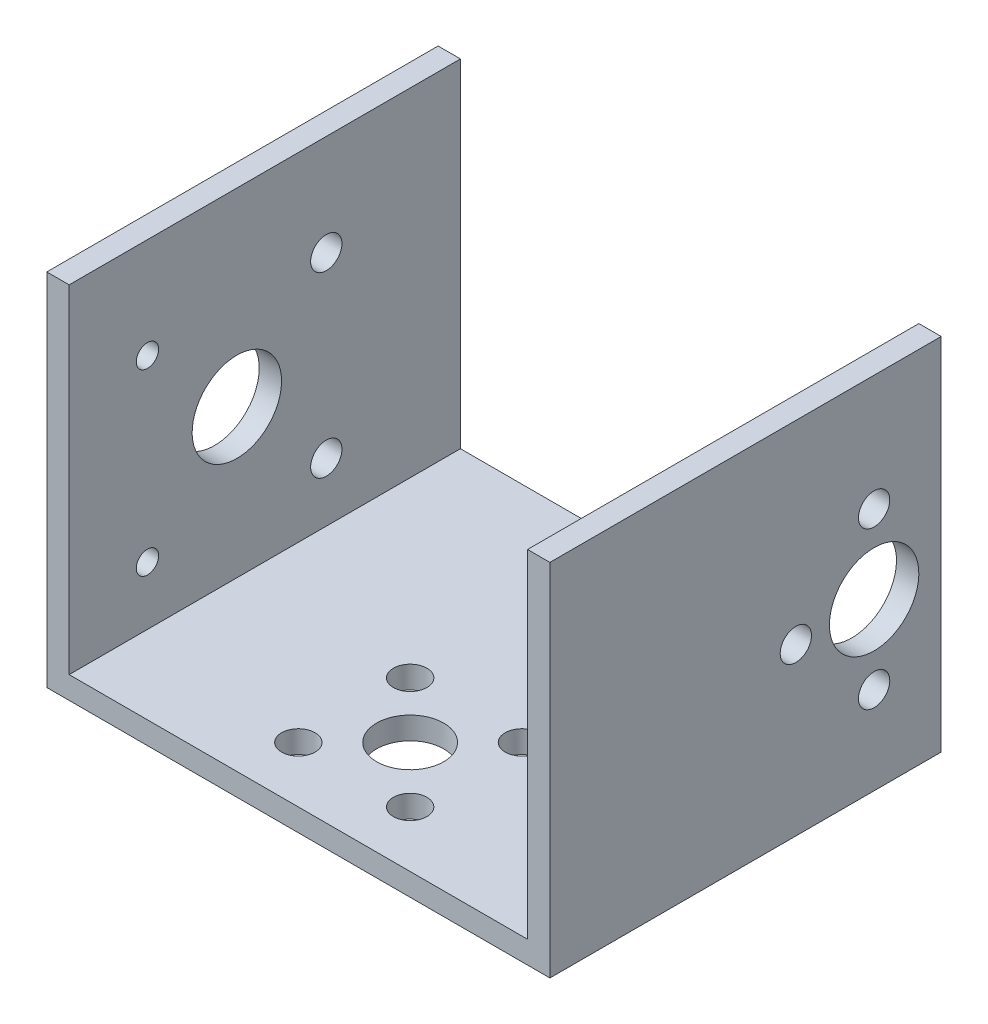
ISO-10303-21;
HEADER;
FILE_DESCRIPTION(('STEP AP214'),'2;1');
FILE_NAME('part.step','',(''),(''),'','','');
FILE_SCHEMA(('AUTOMOTIVE_DESIGN { 1 0 10303 214 1 1 1 1 }'));
ENDSEC;
DATA;
#1=APPLICATION_CONTEXT('core data for automotive mechanical design processes');
#2=APPLICATION_PROTOCOL_DEFINITION('international standard','automotive_design',2000,#1);
#3=PRODUCT_CONTEXT('',#1,'mechanical');
#4=PRODUCT('Part','Part','',(#3));
#5=PRODUCT_RELATED_PRODUCT_CATEGORY('part','',(#4));
#6=PRODUCT_DEFINITION_FORMATION('','',#4);
#7=PRODUCT_DEFINITION_CONTEXT('part definition',#1,'design');
#8=PRODUCT_DEFINITION('design','',#6,#7);
#9=PRODUCT_DEFINITION_SHAPE('','',#8);
#10=(LENGTH_UNIT() NAMED_UNIT(*) SI_UNIT(.MILLI.,.METRE.));
#11=(NAMED_UNIT(*) PLANE_ANGLE_UNIT() SI_UNIT($,.RADIAN.));
#12=(NAMED_UNIT(*) SI_UNIT($,.STERADIAN.) SOLID_ANGLE_UNIT());
#13=UNCERTAINTY_MEASURE_WITH_UNIT(LENGTH_MEASURE(1.E-05),#10,'distance_accuracy_value','');
#14=(GEOMETRIC_REPRESENTATION_CONTEXT(3) GLOBAL_UNCERTAINTY_ASSIGNED_CONTEXT((#13)) GLOBAL_UNIT_ASSIGNED_CONTEXT((#10,
#11,#12)) REPRESENTATION_CONTEXT('',''));
#15=CARTESIAN_POINT('',(0.,0.,0.));
#16=DIRECTION('',(0.,0.,1.));
#17=DIRECTION('',(1.,0.,0.));
#18=AXIS2_PLACEMENT_3D('',#15,#16,#17);
#19=CARTESIAN_POINT('',(20.5,0.902439024390143,20.));
#20=DIRECTION('',(0.,-1.,0.));
#21=DIRECTION('',(0.,0.,-1.));
#22=AXIS2_PLACEMENT_3D('',#19,#20,#21);
#23=PLANE('',#22);
#24=CARTESIAN_POINT('',(5.,0.902439024390144,20.));
#25=DIRECTION('',(0.,-1.,0.));
#26=DIRECTION('',(0.,0.,-1.));
#27=AXIS2_PLACEMENT_3D('',#24,#25,#26);
#28=CIRCLE('',#27,1.5);
#29=CARTESIAN_POINT('',(5.,0.902439024390144,18.5));
#30=VERTEX_POINT('',#29);
#31=EDGE_CURVE('E298',#30,#30,#28,.F.);
#32=ORIENTED_EDGE('',*,*,#31,.F.);
#33=EDGE_LOOP('',(#32));
#34=FACE_BOUND('',#33,.T.);
#35=CARTESIAN_POINT('',(5.,0.902439024390144,10.));
#36=DIRECTION('',(0.,-1.,0.));
#37=DIRECTION('',(0.,0.,-1.));
#38=AXIS2_PLACEMENT_3D('',#35,#36,#37);
#39=CIRCLE('',#38,1.5);
#40=CARTESIAN_POINT('',(5.,0.902439024390144,8.5));
#41=VERTEX_POINT('',#40);
#42=EDGE_CURVE('E297',#41,#41,#39,.F.);
#43=ORIENTED_EDGE('',*,*,#42,.F.);
#44=EDGE_LOOP('',(#43));
#45=FACE_BOUND('',#44,.T.);
#46=CARTESIAN_POINT('',(-5.,0.902439024390144,10.));
#47=DIRECTION('',(0.,-1.,0.));
#48=DIRECTION('',(0.,0.,-1.));
#49=AXIS2_PLACEMENT_3D('',#46,#47,#48);
#50=CIRCLE('',#49,1.5);
#51=CARTESIAN_POINT('',(-5.,0.902439024390144,8.5));
#52=VERTEX_POINT('',#51);
#53=EDGE_CURVE('E306',#52,#52,#50,.F.);
#54=ORIENTED_EDGE('',*,*,#53,.F.);
#55=EDGE_LOOP('',(#54));
#56=FACE_BOUND('',#55,.T.);
#57=CARTESIAN_POINT('',(0.,0.902439024390144,15.));
#58=DIRECTION('',(0.,-1.,0.));
#59=DIRECTION('',(0.,0.,-1.));
#60=AXIS2_PLACEMENT_3D('',#57,#58,#59);
#61=CIRCLE('',#60,3.);
#62=CARTESIAN_POINT('',(0.,0.902439024390144,12.));
#63=VERTEX_POINT('',#62);
#64=EDGE_CURVE('E314',#63,#63,#61,.F.);
#65=ORIENTED_EDGE('',*,*,#64,.F.);
#66=EDGE_LOOP('',(#65));
#67=FACE_BOUND('',#66,.T.);
#68=CARTESIAN_POINT('',(-5.,0.902439024390144,20.));
#69=DIRECTION('',(0.,-1.,0.));
#70=DIRECTION('',(0.,0.,-1.));
#71=AXIS2_PLACEMENT_3D('',#68,#69,#70);
#72=CIRCLE('',#71,1.5);
#73=CARTESIAN_POINT('',(-5.,0.902439024390144,18.5));
#74=VERTEX_POINT('',#73);
#75=EDGE_CURVE('E126',#74,#74,#72,.F.);
#76=ORIENTED_EDGE('',*,*,#75,.F.);
#77=EDGE_LOOP('',(#76));
#78=FACE_BOUND('',#77,.T.);
#79=DIRECTION('',(0.,0.,-1.));
#80=VECTOR('',#79,1.);
#81=CARTESIAN_POINT('',(-20.5,0.902439024390143,20.));
#82=LINE('',#81,#80);
#83=CARTESIAN_POINT('',(-20.5,0.902439024390143,25.));
#84=VERTEX_POINT('',#83);
#85=CARTESIAN_POINT('',(-20.5,0.902439024390144,-10.));
#86=VERTEX_POINT('',#85);
#87=EDGE_CURVE('E68',#84,#86,#82,.T.);
#88=ORIENTED_EDGE('',*,*,#87,.F.);
#89=DIRECTION('',(-1.,0.,0.));
#90=VECTOR('',#89,1.);
#91=CARTESIAN_POINT('',(-22.5,0.902439024390143,25.));
#92=LINE('',#91,#90);
#93=CARTESIAN_POINT('',(20.5,0.902439024390159,25.));
#94=VERTEX_POINT('',#93);
#95=EDGE_CURVE('E113',#94,#84,#92,.T.);
#96=ORIENTED_EDGE('',*,*,#95,.F.);
#97=DIRECTION('',(0.,0.,-1.));
#98=VECTOR('',#97,1.);
#99=CARTESIAN_POINT('',(20.5,0.902439024390143,20.));
#100=LINE('',#99,#98);
#101=CARTESIAN_POINT('',(20.5,0.902439024390158,-10.));
#102=VERTEX_POINT('',#101);
#103=EDGE_CURVE('E60',#94,#102,#100,.T.);
#104=ORIENTED_EDGE('',*,*,#103,.T.);
#105=DIRECTION('',(1.,0.,0.));
#106=VECTOR('',#105,1.);
#107=CARTESIAN_POINT('',(-22.5,0.902439024390143,-10.));
#108=LINE('',#107,#106);
#109=EDGE_CURVE('E114',#86,#102,#108,.T.);
#110=ORIENTED_EDGE('',*,*,#109,.F.);
#111=EDGE_LOOP('',(#88,#96,#104,#110));
#112=FACE_BOUND('',#111,.T.);
#113=ADVANCED_FACE('F43',(#34,#45,#56,#67,#78,#112),#23,.F.);
#114=CARTESIAN_POINT('',(20.5,0.902439024390143,20.));
#115=DIRECTION('',(1.,0.,0.));
#116=DIRECTION('',(0.,0.,-1.));
#117=AXIS2_PLACEMENT_3D('',#114,#115,#116);
#118=PLANE('',#117);
#119=CARTESIAN_POINT('',(20.5,13.7414610293343,3.));
#120=DIRECTION('',(1.,0.,0.));
#121=DIRECTION('',(0.,1.,0.));
#122=AXIS2_PLACEMENT_3D('',#119,#120,#121);
#123=CIRCLE('',#122,1.4);
#124=CARTESIAN_POINT('',(20.5,15.1414610293343,3.));
#125=VERTEX_POINT('',#124);
#126=EDGE_CURVE('E150',#125,#125,#123,.T.);
#127=ORIENTED_EDGE('',*,*,#126,.T.);
#128=EDGE_LOOP('',(#127));
#129=FACE_BOUND('',#128,.T.);
#130=CARTESIAN_POINT('',(20.5,13.7414610293343,-4.));
#131=DIRECTION('',(1.,0.,0.));
#132=DIRECTION('',(0.,1.,0.));
#133=AXIS2_PLACEMENT_3D('',#130,#131,#132);
#134=CIRCLE('',#133,4.);
#135=CARTESIAN_POINT('',(20.5,17.7414610293343,-4.));
#136=VERTEX_POINT('',#135);
#137=EDGE_CURVE('E163',#136,#136,#134,.T.);
#138=ORIENTED_EDGE('',*,*,#137,.T.);
#139=EDGE_LOOP('',(#138));
#140=FACE_BOUND('',#139,.T.);
#141=CARTESIAN_POINT('',(20.5,6.7414610293343,-4.));
#142=DIRECTION('',(1.,0.,0.));
#143=DIRECTION('',(0.,1.,0.));
#144=AXIS2_PLACEMENT_3D('',#141,#142,#143);
#145=CIRCLE('',#144,1.4);
#146=CARTESIAN_POINT('',(20.5,8.14146102933431,-4.));
#147=VERTEX_POINT('',#146);
#148=EDGE_CURVE('E171',#147,#147,#145,.T.);
#149=ORIENTED_EDGE('',*,*,#148,.T.);
#150=EDGE_LOOP('',(#149));
#151=FACE_BOUND('',#150,.T.);
#152=CARTESIAN_POINT('',(20.5,20.7414610293343,-4.));
#153=DIRECTION('',(1.,0.,0.));
#154=DIRECTION('',(0.,1.,0.));
#155=AXIS2_PLACEMENT_3D('',#152,#153,#154);
#156=CIRCLE('',#155,1.4);
#157=CARTESIAN_POINT('',(20.5,22.1414610293343,-4.));
#158=VERTEX_POINT('',#157);
#159=EDGE_CURVE('E148',#158,#158,#156,.T.);
#160=ORIENTED_EDGE('',*,*,#159,.T.);
#161=EDGE_LOOP('',(#160));
#162=FACE_BOUND('',#161,.T.);
#163=DIRECTION('',(0.,1.,0.));
#164=VECTOR('',#163,1.);
#165=CARTESIAN_POINT('',(20.5,31.0975609756098,-10.));
#166=LINE('',#165,#164);
#167=CARTESIAN_POINT('',(20.5,31.0975609756098,-10.));
#168=VERTEX_POINT('',#167);
#169=EDGE_CURVE('E195',#102,#168,#166,.T.);
#170=ORIENTED_EDGE('',*,*,#169,.F.);
#171=ORIENTED_EDGE('',*,*,#103,.F.);
#172=DIRECTION('',(0.,-1.,0.));
#173=VECTOR('',#172,1.);
#174=CARTESIAN_POINT('',(20.5,31.0975609743901,25.));
#175=LINE('',#174,#173);
#176=CARTESIAN_POINT('',(20.5,31.0975609743901,25.));
#177=VERTEX_POINT('',#176);
#178=EDGE_CURVE('E131',#177,#94,#175,.T.);
#179=ORIENTED_EDGE('',*,*,#178,.F.);
#180=DIRECTION('',(0.,0.,-1.));
#181=VECTOR('',#180,1.);
#182=CARTESIAN_POINT('',(20.5,31.0975609756098,20.));
#183=LINE('',#182,#181);
#184=EDGE_CURVE('E252',#177,#168,#183,.T.);
#185=ORIENTED_EDGE('',*,*,#184,.T.);
#186=EDGE_LOOP('',(#170,#171,#179,#185));
#187=FACE_BOUND('',#186,.T.);
#188=ADVANCED_FACE('F329',(#129,#140,#151,#162,#187),#118,.F.);
#189=CARTESIAN_POINT('',(22.5,-1.09756097560984,20.));
#190=DIRECTION('',(0.,1.,0.));
#191=DIRECTION('',(-1.,0.,0.));
#192=AXIS2_PLACEMENT_3D('',#189,#190,#191);
#193=PLANE('',#192);
#194=CARTESIAN_POINT('',(5.,-1.09756097560985,20.));
#195=DIRECTION('',(0.,-1.,0.));
#196=DIRECTION('',(-1.,0.,0.));
#197=AXIS2_PLACEMENT_3D('',#194,#195,#196);
#198=CIRCLE('',#197,1.5);
#199=CARTESIAN_POINT('',(3.5,-1.09756097560985,20.));
#200=VERTEX_POINT('',#199);
#201=EDGE_CURVE('E293',#200,#200,#198,.T.);
#202=ORIENTED_EDGE('',*,*,#201,.F.);
#203=EDGE_LOOP('',(#202));
#204=FACE_BOUND('',#203,.T.);
#205=CARTESIAN_POINT('',(5.,-1.09756097560985,10.));
#206=DIRECTION('',(0.,-1.,0.));
#207=DIRECTION('',(1.,0.,0.));
#208=AXIS2_PLACEMENT_3D('',#205,#206,#207);
#209=CIRCLE('',#208,1.5);
#210=CARTESIAN_POINT('',(6.5,-1.09756097560985,10.));
#211=VERTEX_POINT('',#210);
#212=EDGE_CURVE('E302',#211,#211,#209,.T.);
#213=ORIENTED_EDGE('',*,*,#212,.F.);
#214=EDGE_LOOP('',(#213));
#215=FACE_BOUND('',#214,.T.);
#216=CARTESIAN_POINT('',(-5.,-1.09756097560985,10.));
#217=DIRECTION('',(0.,-1.,0.));
#218=DIRECTION('',(-1.,0.,0.));
#219=AXIS2_PLACEMENT_3D('',#216,#217,#218);
#220=CIRCLE('',#219,1.5);
#221=CARTESIAN_POINT('',(-6.5,-1.09756097560985,10.));
#222=VERTEX_POINT('',#221);
#223=EDGE_CURVE('E310',#222,#222,#220,.T.);
#224=ORIENTED_EDGE('',*,*,#223,.F.);
#225=EDGE_LOOP('',(#224));
#226=FACE_BOUND('',#225,.T.);
#227=CARTESIAN_POINT('',(0.,-1.09756097560985,15.));
#228=DIRECTION('',(0.,-1.,0.));
#229=DIRECTION('',(1.,0.,0.));
#230=AXIS2_PLACEMENT_3D('',#227,#228,#229);
#231=CIRCLE('',#230,3.);
#232=CARTESIAN_POINT('',(3.,-1.09756097560985,15.));
#233=VERTEX_POINT('',#232);
#234=EDGE_CURVE('E292',#233,#233,#231,.T.);
#235=ORIENTED_EDGE('',*,*,#234,.F.);
#236=EDGE_LOOP('',(#235));
#237=FACE_BOUND('',#236,.T.);
#238=CARTESIAN_POINT('',(-5.,-1.09756097560985,20.));
#239=DIRECTION('',(0.,-1.,0.));
#240=DIRECTION('',(1.,0.,0.));
#241=AXIS2_PLACEMENT_3D('',#238,#239,#240);
#242=CIRCLE('',#241,1.5);
#243=CARTESIAN_POINT('',(-3.5,-1.09756097560985,20.));
#244=VERTEX_POINT('',#243);
#245=EDGE_CURVE('E288',#244,#244,#242,.T.);
#246=ORIENTED_EDGE('',*,*,#245,.F.);
#247=EDGE_LOOP('',(#246));
#248=FACE_BOUND('',#247,.T.);
#249=DIRECTION('',(0.,0.,-1.));
#250=VECTOR('',#249,1.);
#251=CARTESIAN_POINT('',(-22.5,-1.09756097560986,20.));
#252=LINE('',#251,#250);
#253=CARTESIAN_POINT('',(-22.5,-1.09756097560986,25.));
#254=VERTEX_POINT('',#253);
#255=CARTESIAN_POINT('',(-22.5,-1.09756097560986,-10.));
#256=VERTEX_POINT('',#255);
#257=EDGE_CURVE('E11',#254,#256,#252,.T.);
#258=ORIENTED_EDGE('',*,*,#257,.T.);
#259=DIRECTION('',(1.,0.,0.));
#260=VECTOR('',#259,1.);
#261=CARTESIAN_POINT('',(20.5,-1.09756097560984,-10.));
#262=LINE('',#261,#260);
#263=CARTESIAN_POINT('',(22.5,-1.09756097560984,-10.));
#264=VERTEX_POINT('',#263);
#265=EDGE_CURVE('E198',#256,#264,#262,.T.);
#266=ORIENTED_EDGE('',*,*,#265,.T.);
#267=DIRECTION('',(0.,0.,-1.));
#268=VECTOR('',#267,1.);
#269=CARTESIAN_POINT('',(22.5,-1.09756097560984,20.));
#270=LINE('',#269,#268);
#271=CARTESIAN_POINT('',(22.5,-1.09756097560984,25.));
#272=VERTEX_POINT('',#271);
#273=EDGE_CURVE('E53',#272,#264,#270,.T.);
#274=ORIENTED_EDGE('',*,*,#273,.F.);
#275=DIRECTION('',(-1.,0.,0.));
#276=VECTOR('',#275,1.);
#277=CARTESIAN_POINT('',(-22.5,-1.09756097560986,25.));
#278=LINE('',#277,#276);
#279=EDGE_CURVE('E134',#272,#254,#278,.T.);
#280=ORIENTED_EDGE('',*,*,#279,.T.);
#281=EDGE_LOOP('',(#258,#266,#274,#280));
#282=FACE_BOUND('',#281,.T.);
#283=ADVANCED_FACE('F45',(#204,#215,#226,#237,#248,#282),#193,.F.);
#284=CARTESIAN_POINT('',(22.5,1.09756097560985,20.));
#285=DIRECTION('',(-1.,0.,0.));
#286=DIRECTION('',(0.,-1.,0.));
#287=AXIS2_PLACEMENT_3D('',#284,#285,#286);
#288=PLANE('',#287);
#289=DIRECTION('',(0.,0.,-1.));
#290=VECTOR('',#289,1.);
#291=CARTESIAN_POINT('',(22.5,31.0975609756098,20.));
#292=LINE('',#291,#290);
#293=CARTESIAN_POINT('',(22.5,31.0975609743901,25.));
#294=VERTEX_POINT('',#293);
#295=CARTESIAN_POINT('',(22.5,31.0975609756098,-10.));
#296=VERTEX_POINT('',#295);
#297=EDGE_CURVE('E256',#294,#296,#292,.T.);
#298=ORIENTED_EDGE('',*,*,#297,.F.);
#299=DIRECTION('',(0.,-1.,0.));
#300=VECTOR('',#299,1.);
#301=CARTESIAN_POINT('',(22.5,0.902439024390159,25.));
#302=LINE('',#301,#300);
#303=EDGE_CURVE('E133',#294,#272,#302,.T.);
#304=ORIENTED_EDGE('',*,*,#303,.T.);
#305=ORIENTED_EDGE('',*,*,#273,.T.);
#306=DIRECTION('',(0.,1.,0.));
#307=VECTOR('',#306,1.);
#308=CARTESIAN_POINT('',(22.5,31.0975609756098,-10.));
#309=LINE('',#308,#307);
#310=EDGE_CURVE('E194',#264,#296,#309,.T.);
#311=ORIENTED_EDGE('',*,*,#310,.T.);
#312=EDGE_LOOP('',(#298,#304,#305,#311));
#313=FACE_BOUND('',#312,.T.);
#314=CARTESIAN_POINT('',(22.5,13.7414610293343,3.));
#315=DIRECTION('',(1.,0.,0.));
#316=DIRECTION('',(0.,1.,0.));
#317=AXIS2_PLACEMENT_3D('',#314,#315,#316);
#318=CIRCLE('',#317,1.4);
#319=CARTESIAN_POINT('',(22.5,15.1414610293343,3.));
#320=VERTEX_POINT('',#319);
#321=EDGE_CURVE('E155',#320,#320,#318,.T.);
#322=ORIENTED_EDGE('',*,*,#321,.F.);
#323=EDGE_LOOP('',(#322));
#324=FACE_BOUND('',#323,.T.);
#325=CARTESIAN_POINT('',(22.5,13.7414610293343,-4.));
#326=DIRECTION('',(1.,0.,0.));
#327=DIRECTION('',(0.,1.,0.));
#328=AXIS2_PLACEMENT_3D('',#325,#326,#327);
#329=CIRCLE('',#328,4.);
#330=CARTESIAN_POINT('',(22.5,17.7414610293343,-4.));
#331=VERTEX_POINT('',#330);
#332=EDGE_CURVE('E159',#331,#331,#329,.T.);
#333=ORIENTED_EDGE('',*,*,#332,.F.);
#334=EDGE_LOOP('',(#333));
#335=FACE_BOUND('',#334,.T.);
#336=CARTESIAN_POINT('',(22.5,6.7414610293343,-4.));
#337=DIRECTION('',(1.,0.,0.));
#338=DIRECTION('',(0.,1.,0.));
#339=AXIS2_PLACEMENT_3D('',#336,#337,#338);
#340=CIRCLE('',#339,1.4);
#341=CARTESIAN_POINT('',(22.5,8.14146102933431,-4.));
#342=VERTEX_POINT('',#341);
#343=EDGE_CURVE('E167',#342,#342,#340,.T.);
#344=ORIENTED_EDGE('',*,*,#343,.F.);
#345=EDGE_LOOP('',(#344));
#346=FACE_BOUND('',#345,.T.);
#347=CARTESIAN_POINT('',(22.5,20.7414610293343,-4.));
#348=DIRECTION('',(1.,0.,0.));
#349=DIRECTION('',(0.,1.,0.));
#350=AXIS2_PLACEMENT_3D('',#347,#348,#349);
#351=CIRCLE('',#350,1.4);
#352=CARTESIAN_POINT('',(22.5,22.1414610293343,-4.));
#353=VERTEX_POINT('',#352);
#354=EDGE_CURVE('E175',#353,#353,#351,.T.);
#355=ORIENTED_EDGE('',*,*,#354,.F.);
#356=EDGE_LOOP('',(#355));
#357=FACE_BOUND('',#356,.T.);
#358=ADVANCED_FACE('F261',(#313,#324,#335,#346,#357),#288,.F.);
#359=CARTESIAN_POINT('',(22.5,31.0975609756098,20.));
#360=DIRECTION('',(0.,-1.,0.));
#361=DIRECTION('',(0.,0.,-1.));
#362=AXIS2_PLACEMENT_3D('',#359,#360,#361);
#363=PLANE('',#362);
#364=ORIENTED_EDGE('',*,*,#297,.T.);
#365=DIRECTION('',(1.,0.,0.));
#366=VECTOR('',#365,1.);
#367=CARTESIAN_POINT('',(20.5,31.0975609756098,-10.));
#368=LINE('',#367,#366);
#369=EDGE_CURVE('E202',#168,#296,#368,.T.);
#370=ORIENTED_EDGE('',*,*,#369,.F.);
#371=ORIENTED_EDGE('',*,*,#184,.F.);
#372=DIRECTION('',(1.,0.,0.));
#373=VECTOR('',#372,1.);
#374=CARTESIAN_POINT('',(20.5,31.0975609743901,25.));
#375=LINE('',#374,#373);
#376=EDGE_CURVE('E274',#177,#294,#375,.T.);
#377=ORIENTED_EDGE('',*,*,#376,.T.);
#378=EDGE_LOOP('',(#364,#370,#371,#377));
#379=FACE_BOUND('',#378,.T.);
#380=ADVANCED_FACE('F272',(#379),#363,.F.);
#381=CARTESIAN_POINT('',(-20.5,0.902439024390143,20.));
#382=DIRECTION('',(-1.,0.,0.));
#383=DIRECTION('',(0.,0.,1.));
#384=AXIS2_PLACEMENT_3D('',#381,#382,#383);
#385=PLANE('',#384);
#386=CARTESIAN_POINT('',(-20.5,6.17195122439014,2.));
#387=DIRECTION('',(-1.,0.,0.));
#388=DIRECTION('',(0.,0.,1.));
#389=AXIS2_PLACEMENT_3D('',#386,#387,#388);
#390=CIRCLE('',#389,1.4);
#391=CARTESIAN_POINT('',(-20.5,6.17195122439014,3.4));
#392=VERTEX_POINT('',#391);
#393=EDGE_CURVE('E224',#392,#392,#390,.F.);
#394=ORIENTED_EDGE('',*,*,#393,.F.);
#395=EDGE_LOOP('',(#394));
#396=FACE_BOUND('',#395,.T.);
#397=CARTESIAN_POINT('',(-20.5,6.12195121951222,18.));
#398=DIRECTION('',(-1.,0.,0.));
#399=DIRECTION('',(0.,0.,1.));
#400=AXIS2_PLACEMENT_3D('',#397,#398,#399);
#401=CIRCLE('',#400,1.);
#402=CARTESIAN_POINT('',(-20.5,6.12195121951222,19.));
#403=VERTEX_POINT('',#402);
#404=EDGE_CURVE('E215',#403,#403,#401,.F.);
#405=ORIENTED_EDGE('',*,*,#404,.F.);
#406=EDGE_LOOP('',(#405));
#407=FACE_BOUND('',#406,.T.);
#408=CARTESIAN_POINT('',(-20.5,22.1219512195122,18.));
#409=DIRECTION('',(-1.,0.,0.));
#410=DIRECTION('',(0.,0.,1.));
#411=AXIS2_PLACEMENT_3D('',#408,#409,#410);
#412=CIRCLE('',#411,1.);
#413=CARTESIAN_POINT('',(-20.5,22.1219512195122,19.));
#414=VERTEX_POINT('',#413);
#415=EDGE_CURVE('E214',#414,#414,#412,.F.);
#416=ORIENTED_EDGE('',*,*,#415,.F.);
#417=EDGE_LOOP('',(#416));
#418=FACE_BOUND('',#417,.T.);
#419=CARTESIAN_POINT('',(-20.5,22.0963414643901,2.));
#420=DIRECTION('',(-1.,0.,0.));
#421=DIRECTION('',(0.,0.,1.));
#422=AXIS2_PLACEMENT_3D('',#419,#420,#421);
#423=CIRCLE('',#422,1.4);
#424=CARTESIAN_POINT('',(-20.5,22.0963414643901,3.4));
#425=VERTEX_POINT('',#424);
#426=EDGE_CURVE('E219',#425,#425,#423,.F.);
#427=ORIENTED_EDGE('',*,*,#426,.F.);
#428=EDGE_LOOP('',(#427));
#429=FACE_BOUND('',#428,.T.);
#430=CARTESIAN_POINT('',(-20.5,14.1463414634146,10.));
#431=DIRECTION('',(-1.,0.,0.));
#432=DIRECTION('',(0.,0.,1.));
#433=AXIS2_PLACEMENT_3D('',#430,#431,#432);
#434=CIRCLE('',#433,4.);
#435=CARTESIAN_POINT('',(-20.5,18.1463414634146,10.));
#436=VERTEX_POINT('',#435);
#437=EDGE_CURVE('E241',#436,#436,#434,.F.);
#438=ORIENTED_EDGE('',*,*,#437,.F.);
#439=EDGE_LOOP('',(#438));
#440=FACE_BOUND('',#439,.T.);
#441=ORIENTED_EDGE('',*,*,#87,.T.);
#442=DIRECTION('',(0.,-1.,0.));
#443=VECTOR('',#442,1.);
#444=CARTESIAN_POINT('',(-20.5,31.0975609756098,-10.));
#445=LINE('',#444,#443);
#446=CARTESIAN_POINT('',(-20.5,31.0975609756098,-10.));
#447=VERTEX_POINT('',#446);
#448=EDGE_CURVE('E154',#447,#86,#445,.T.);
#449=ORIENTED_EDGE('',*,*,#448,.F.);
#450=DIRECTION('',(0.,0.,-1.));
#451=VECTOR('',#450,1.);
#452=CARTESIAN_POINT('',(-20.5,31.0975609756098,20.));
#453=LINE('',#452,#451);
#454=CARTESIAN_POINT('',(-20.5,31.0975609743901,25.));
#455=VERTEX_POINT('',#454);
#456=EDGE_CURVE('E116',#455,#447,#453,.T.);
#457=ORIENTED_EDGE('',*,*,#456,.F.);
#458=DIRECTION('',(0.,-1.,0.));
#459=VECTOR('',#458,1.);
#460=CARTESIAN_POINT('',(-20.5,31.0975609743901,25.));
#461=LINE('',#460,#459);
#462=EDGE_CURVE('E119',#455,#84,#461,.T.);
#463=ORIENTED_EDGE('',*,*,#462,.T.);
#464=EDGE_LOOP('',(#441,#449,#457,#463));
#465=FACE_BOUND('',#464,.T.);
#466=ADVANCED_FACE('F120',(#396,#407,#418,#429,#440,#465),#385,.F.);
#467=CARTESIAN_POINT('',(-22.5,31.0975609756098,20.));
#468=DIRECTION('',(0.,-1.,0.));
#469=DIRECTION('',(0.,0.,-1.));
#470=AXIS2_PLACEMENT_3D('',#467,#468,#469);
#471=PLANE('',#470);
#472=ORIENTED_EDGE('',*,*,#456,.T.);
#473=DIRECTION('',(-1.,0.,0.));
#474=VECTOR('',#473,1.);
#475=CARTESIAN_POINT('',(-20.5,31.0975609756098,-10.));
#476=LINE('',#475,#474);
#477=CARTESIAN_POINT('',(-22.5,31.0975609756098,-10.));
#478=VERTEX_POINT('',#477);
#479=EDGE_CURVE('E184',#447,#478,#476,.T.);
#480=ORIENTED_EDGE('',*,*,#479,.T.);
#481=DIRECTION('',(0.,0.,-1.));
#482=VECTOR('',#481,1.);
#483=CARTESIAN_POINT('',(-22.5,31.0975609756098,20.));
#484=LINE('',#483,#482);
#485=CARTESIAN_POINT('',(-22.5,31.0975609743901,25.));
#486=VERTEX_POINT('',#485);
#487=EDGE_CURVE('E245',#486,#478,#484,.T.);
#488=ORIENTED_EDGE('',*,*,#487,.F.);
#489=DIRECTION('',(1.,0.,0.));
#490=VECTOR('',#489,1.);
#491=CARTESIAN_POINT('',(-20.5,31.0975609743901,25.));
#492=LINE('',#491,#490);
#493=EDGE_CURVE('E125',#486,#455,#492,.T.);
#494=ORIENTED_EDGE('',*,*,#493,.T.);
#495=EDGE_LOOP('',(#472,#480,#488,#494));
#496=FACE_BOUND('',#495,.T.);
#497=ADVANCED_FACE('F280',(#496),#471,.F.);
#498=CARTESIAN_POINT('',(-22.5,1.09756097560985,20.));
#499=DIRECTION('',(1.,0.,0.));
#500=DIRECTION('',(0.,1.,0.));
#501=AXIS2_PLACEMENT_3D('',#498,#499,#500);
#502=PLANE('',#501);
#503=CARTESIAN_POINT('',(-22.5,6.17195122439014,2.));
#504=DIRECTION('',(-1.,0.,0.));
#505=DIRECTION('',(0.,1.,0.));
#506=AXIS2_PLACEMENT_3D('',#503,#504,#505);
#507=CIRCLE('',#506,1.4);
#508=CARTESIAN_POINT('',(-22.5,7.57195122439014,2.));
#509=VERTEX_POINT('',#508);
#510=EDGE_CURVE('E206',#509,#509,#507,.T.);
#511=ORIENTED_EDGE('',*,*,#510,.F.);
#512=EDGE_LOOP('',(#511));
#513=FACE_BOUND('',#512,.T.);
#514=CARTESIAN_POINT('',(-22.5,6.12195121951222,18.));
#515=DIRECTION('',(-1.,0.,0.));
#516=DIRECTION('',(0.,1.,0.));
#517=AXIS2_PLACEMENT_3D('',#514,#515,#516);
#518=CIRCLE('',#517,1.);
#519=CARTESIAN_POINT('',(-22.5,7.12195121951222,18.));
#520=VERTEX_POINT('',#519);
#521=EDGE_CURVE('E220',#520,#520,#518,.T.);
#522=ORIENTED_EDGE('',*,*,#521,.F.);
#523=EDGE_LOOP('',(#522));
#524=FACE_BOUND('',#523,.T.);
#525=CARTESIAN_POINT('',(-22.5,22.1219512195122,18.));
#526=DIRECTION('',(-1.,0.,0.));
#527=DIRECTION('',(0.,-1.,0.));
#528=AXIS2_PLACEMENT_3D('',#525,#526,#527);
#529=CIRCLE('',#528,1.);
#530=CARTESIAN_POINT('',(-22.5,21.1219512195122,18.));
#531=VERTEX_POINT('',#530);
#532=EDGE_CURVE('E210',#531,#531,#529,.T.);
#533=ORIENTED_EDGE('',*,*,#532,.F.);
#534=EDGE_LOOP('',(#533));
#535=FACE_BOUND('',#534,.T.);
#536=CARTESIAN_POINT('',(-22.5,22.0963414643901,2.));
#537=DIRECTION('',(-1.,0.,0.));
#538=DIRECTION('',(0.,-1.,0.));
#539=AXIS2_PLACEMENT_3D('',#536,#537,#538);
#540=CIRCLE('',#539,1.4);
#541=CARTESIAN_POINT('',(-22.5,20.6963414643901,2.));
#542=VERTEX_POINT('',#541);
#543=EDGE_CURVE('E237',#542,#542,#540,.T.);
#544=ORIENTED_EDGE('',*,*,#543,.F.);
#545=EDGE_LOOP('',(#544));
#546=FACE_BOUND('',#545,.T.);
#547=CARTESIAN_POINT('',(-22.5,14.1463414634146,10.));
#548=DIRECTION('',(1.,0.,0.));
#549=DIRECTION('',(0.,1.,0.));
#550=AXIS2_PLACEMENT_3D('',#547,#548,#549);
#551=CIRCLE('',#550,4.);
#552=CARTESIAN_POINT('',(-22.5,18.1463414634146,10.));
#553=VERTEX_POINT('',#552);
#554=EDGE_CURVE('E47',#553,#553,#551,.F.);
#555=ORIENTED_EDGE('',*,*,#554,.F.);
#556=EDGE_LOOP('',(#555));
#557=FACE_BOUND('',#556,.T.);
#558=ORIENTED_EDGE('',*,*,#487,.T.);
#559=DIRECTION('',(0.,-1.,0.));
#560=VECTOR('',#559,1.);
#561=CARTESIAN_POINT('',(-22.5,0.902439024390143,-10.));
#562=LINE('',#561,#560);
#563=EDGE_CURVE('E190',#478,#256,#562,.T.);
#564=ORIENTED_EDGE('',*,*,#563,.T.);
#565=ORIENTED_EDGE('',*,*,#257,.F.);
#566=DIRECTION('',(0.,-1.,0.));
#567=VECTOR('',#566,1.);
#568=CARTESIAN_POINT('',(-22.5,0.902439024390143,25.));
#569=LINE('',#568,#567);
#570=EDGE_CURVE('E139',#486,#254,#569,.T.);
#571=ORIENTED_EDGE('',*,*,#570,.F.);
#572=EDGE_LOOP('',(#558,#564,#565,#571));
#573=FACE_BOUND('',#572,.T.);
#574=ADVANCED_FACE('F277',(#513,#524,#535,#546,#557,#573),#502,.F.);
#575=CARTESIAN_POINT('',(-22.500012,14.1463414634146,10.));
#576=DIRECTION('',(1.,0.,0.));
#577=DIRECTION('',(0.,1.,0.));
#578=AXIS2_PLACEMENT_3D('',#575,#576,#577);
#579=CYLINDRICAL_SURFACE('',#578,4.);
#580=CARTESIAN_POINT('',(-20.5,18.1463414634146,10.));
#581=CARTESIAN_POINT('',(-20.5208333333333,18.1463414634146,10.));
#582=CARTESIAN_POINT('',(-20.5416666666667,18.1463414634146,10.));
#583=CARTESIAN_POINT('',(-20.5833333333333,18.1463414634146,10.));
#584=CARTESIAN_POINT('',(-20.6041666666667,18.1463414634146,10.));
#585=CARTESIAN_POINT('',(-20.6458333333333,18.1463414634146,10.));
#586=CARTESIAN_POINT('',(-20.6666666666667,18.1463414634146,10.));
#587=CARTESIAN_POINT('',(-20.7083333333333,18.1463414634146,10.));
#588=CARTESIAN_POINT('',(-20.7291666666667,18.1463414634146,10.));
#589=CARTESIAN_POINT('',(-20.7708333333333,18.1463414634146,10.));
#590=CARTESIAN_POINT('',(-20.7916666666667,18.1463414634146,10.));
#591=CARTESIAN_POINT('',(-20.8333333333333,18.1463414634146,10.));
#592=CARTESIAN_POINT('',(-20.8541666666667,18.1463414634146,10.));
#593=CARTESIAN_POINT('',(-20.8958333333333,18.1463414634146,10.));
#594=CARTESIAN_POINT('',(-20.9166666666667,18.1463414634146,10.));
#595=CARTESIAN_POINT('',(-20.9583333333333,18.1463414634146,10.));
#596=CARTESIAN_POINT('',(-20.9791666666667,18.1463414634146,10.));
#597=CARTESIAN_POINT('',(-21.0208333333333,18.1463414634146,10.));
#598=CARTESIAN_POINT('',(-21.0416666666667,18.1463414634146,10.));
#599=CARTESIAN_POINT('',(-21.0833333333333,18.1463414634146,10.));
#600=CARTESIAN_POINT('',(-21.1041666666667,18.1463414634146,10.));
#601=CARTESIAN_POINT('',(-21.1458333333333,18.1463414634146,10.));
#602=CARTESIAN_POINT('',(-21.1666666666667,18.1463414634146,10.));
#603=CARTESIAN_POINT('',(-21.2083333333333,18.1463414634146,10.));
#604=CARTESIAN_POINT('',(-21.2291666666667,18.1463414634146,10.));
#605=CARTESIAN_POINT('',(-21.2708333333333,18.1463414634146,10.));
#606=CARTESIAN_POINT('',(-21.2916666666667,18.1463414634146,10.));
#607=CARTESIAN_POINT('',(-21.3333333333333,18.1463414634146,10.));
#608=CARTESIAN_POINT('',(-21.3541666666667,18.1463414634146,10.));
#609=CARTESIAN_POINT('',(-21.3958333333333,18.1463414634146,10.));
#610=CARTESIAN_POINT('',(-21.4166666666667,18.1463414634146,10.));
#611=CARTESIAN_POINT('',(-21.4583333333333,18.1463414634146,10.));
#612=CARTESIAN_POINT('',(-21.4791666666667,18.1463414634146,10.));
#613=CARTESIAN_POINT('',(-21.5208333333333,18.1463414634146,10.));
#614=CARTESIAN_POINT('',(-21.5416666666667,18.1463414634146,10.));
#615=CARTESIAN_POINT('',(-21.5833333333333,18.1463414634146,10.));
#616=CARTESIAN_POINT('',(-21.6041666666667,18.1463414634146,10.));
#617=CARTESIAN_POINT('',(-21.6458333333333,18.1463414634146,10.));
#618=CARTESIAN_POINT('',(-21.6666666666667,18.1463414634146,10.));
#619=CARTESIAN_POINT('',(-21.7083333333333,18.1463414634146,10.));
#620=CARTESIAN_POINT('',(-21.7291666666667,18.1463414634146,10.));
#621=CARTESIAN_POINT('',(-21.7708333333333,18.1463414634146,10.));
#622=CARTESIAN_POINT('',(-21.7916666666667,18.1463414634146,10.));
#623=CARTESIAN_POINT('',(-21.8333333333333,18.1463414634146,10.));
#624=CARTESIAN_POINT('',(-21.8541666666667,18.1463414634146,10.));
#625=CARTESIAN_POINT('',(-21.8958333333333,18.1463414634146,10.));
#626=CARTESIAN_POINT('',(-21.9166666666667,18.1463414634146,10.));
#627=CARTESIAN_POINT('',(-21.9583333333333,18.1463414634146,10.));
#628=CARTESIAN_POINT('',(-21.9791666666667,18.1463414634146,10.));
#629=CARTESIAN_POINT('',(-22.0208333333333,18.1463414634146,10.));
#630=CARTESIAN_POINT('',(-22.0416666666667,18.1463414634146,10.));
#631=CARTESIAN_POINT('',(-22.0833333333333,18.1463414634146,10.));
#632=CARTESIAN_POINT('',(-22.1041666666667,18.1463414634146,10.));
#633=CARTESIAN_POINT('',(-22.1458333333333,18.1463414634146,10.));
#634=CARTESIAN_POINT('',(-22.1666666666667,18.1463414634146,10.));
#635=CARTESIAN_POINT('',(-22.2083333333333,18.1463414634146,10.));
#636=CARTESIAN_POINT('',(-22.2291666666667,18.1463414634146,10.));
#637=CARTESIAN_POINT('',(-22.2708333333333,18.1463414634146,10.));
#638=CARTESIAN_POINT('',(-22.2916666666667,18.1463414634146,10.));
#639=CARTESIAN_POINT('',(-22.3333333333333,18.1463414634146,10.));
#640=CARTESIAN_POINT('',(-22.3541666666667,18.1463414634146,10.));
#641=CARTESIAN_POINT('',(-22.3958333333333,18.1463414634146,10.));
#642=CARTESIAN_POINT('',(-22.4166666666667,18.1463414634146,10.));
#643=CARTESIAN_POINT('',(-22.4583333333333,18.1463414634146,10.));
#644=CARTESIAN_POINT('',(-22.4791666666667,18.1463414634146,10.));
#645=CARTESIAN_POINT('',(-22.5,18.1463414634146,10.));
#646=B_SPLINE_CURVE_WITH_KNOTS('',3,(#580,#581,#582,#583,#584,#585,#586,#587,#588,#589,#590,
#591,#592,#593,#594,#595,#596,#597,#598,#599,#600,#601,#602,#603,#604,#605,#606,#607,#608,#609,
#610,#611,#612,#613,#614,#615,#616,#617,#618,#619,#620,#621,#622,#623,#624,#625,#626,#627,#628,
#629,#630,#631,#632,#633,#634,#635,#636,#637,#638,#639,#640,#641,#642,#643,#644,#645),
.UNSPECIFIED.,.F.,.F.,(4,2,2,2,2,2,2,2,2,2,2,2,2,2,2,2,2,2,2,2,2,2,2,2,2,2,2,2,2,2,2,2,4),(0.,
0.0624999999999966,0.124999999999997,0.187499999999997,0.249999999999997,0.312499999999997,
0.374999999999997,0.437499999999997,0.499999999999997,0.562499999999997,0.624999999999997,
0.687499999999997,0.749999999999994,0.812499999999994,0.874999999999994,0.937499999999994,
0.999999999999994,1.06249999999999,1.12499999999999,1.18749999999999,1.24999999999999,
1.31249999999999,1.37499999999999,1.43749999999999,1.49999999999999,1.56249999999999,
1.62499999999999,1.68749999999999,1.74999999999999,1.81249999999999,1.87499999999999,
1.93749999999999,1.99999999999999),.UNSPECIFIED.);
#647=EDGE_CURVE('BSEAM383',#436,#553,#646,.T.);
#648=ORIENTED_EDGE('',*,*,#437,.T.);
#649=ORIENTED_EDGE('',*,*,#554,.T.);
#650=ORIENTED_EDGE('',*,*,#647,.T.);
#651=ORIENTED_EDGE('',*,*,#647,.F.);
#652=EDGE_LOOP('',(#648,#650,#649,#651));
#653=FACE_BOUND('',#652,.T.);
#654=ADVANCED_FACE('F383',(#653),#579,.F.);
#655=CARTESIAN_POINT('',(22.501,22.0963414643901,2.));
#656=DIRECTION('',(-1.,0.,0.));
#657=DIRECTION('',(0.,-1.,0.));
#658=AXIS2_PLACEMENT_3D('',#655,#656,#657);
#659=CYLINDRICAL_SURFACE('',#658,1.4);
#660=ORIENTED_EDGE('',*,*,#543,.T.);
#661=EDGE_LOOP('',(#660));
#662=FACE_BOUND('',#661,.T.);
#663=ORIENTED_EDGE('',*,*,#426,.T.);
#664=EDGE_LOOP('',(#663));
#665=FACE_BOUND('',#664,.T.);
#666=ADVANCED_FACE('F373',(#662,#665),#659,.F.);
#667=CARTESIAN_POINT('',(22.501,22.1219512195122,18.));
#668=DIRECTION('',(-1.,0.,0.));
#669=DIRECTION('',(0.,-1.,0.));
#670=AXIS2_PLACEMENT_3D('',#667,#668,#669);
#671=CYLINDRICAL_SURFACE('',#670,1.);
#672=ORIENTED_EDGE('',*,*,#532,.T.);
#673=EDGE_LOOP('',(#672));
#674=FACE_BOUND('',#673,.T.);
#675=ORIENTED_EDGE('',*,*,#415,.T.);
#676=EDGE_LOOP('',(#675));
#677=FACE_BOUND('',#676,.T.);
#678=ADVANCED_FACE('F369',(#674,#677),#671,.F.);
#679=CARTESIAN_POINT('',(22.501,6.12195121951222,18.));
#680=DIRECTION('',(-1.,0.,0.));
#681=DIRECTION('',(0.,-1.,0.));
#682=AXIS2_PLACEMENT_3D('',#679,#680,#681);
#683=CYLINDRICAL_SURFACE('',#682,1.);
#684=ORIENTED_EDGE('',*,*,#521,.T.);
#685=EDGE_LOOP('',(#684));
#686=FACE_BOUND('',#685,.T.);
#687=ORIENTED_EDGE('',*,*,#404,.T.);
#688=EDGE_LOOP('',(#687));
#689=FACE_BOUND('',#688,.T.);
#690=ADVANCED_FACE('F372',(#686,#689),#683,.F.);
#691=CARTESIAN_POINT('',(22.501,6.17195122439014,2.));
#692=DIRECTION('',(-1.,0.,0.));
#693=DIRECTION('',(0.,-1.,0.));
#694=AXIS2_PLACEMENT_3D('',#691,#692,#693);
#695=CYLINDRICAL_SURFACE('',#694,1.4);
#696=ORIENTED_EDGE('',*,*,#510,.T.);
#697=EDGE_LOOP('',(#696));
#698=FACE_BOUND('',#697,.T.);
#699=ORIENTED_EDGE('',*,*,#393,.T.);
#700=EDGE_LOOP('',(#699));
#701=FACE_BOUND('',#700,.T.);
#702=ADVANCED_FACE('F368',(#698,#701),#695,.F.);
#703=CARTESIAN_POINT('',(20.5,31.0975609756098,-10.));
#704=DIRECTION('',(0.,0.,-1.));
#705=DIRECTION('',(0.,1.,0.));
#706=AXIS2_PLACEMENT_3D('',#703,#704,#705);
#707=PLANE('',#706);
#708=ORIENTED_EDGE('',*,*,#310,.F.);
#709=ORIENTED_EDGE('',*,*,#265,.F.);
#710=ORIENTED_EDGE('',*,*,#563,.F.);
#711=ORIENTED_EDGE('',*,*,#479,.F.);
#712=ORIENTED_EDGE('',*,*,#448,.T.);
#713=ORIENTED_EDGE('',*,*,#109,.T.);
#714=ORIENTED_EDGE('',*,*,#169,.T.);
#715=ORIENTED_EDGE('',*,*,#369,.T.);
#716=EDGE_LOOP('',(#708,#709,#710,#711,#712,#713,#714,#715));
#717=FACE_BOUND('',#716,.T.);
#718=ADVANCED_FACE('F269',(#717),#707,.T.);
#719=CARTESIAN_POINT('',(20.5,20.7414610293343,-4.));
#720=DIRECTION('',(1.,0.,0.));
#721=DIRECTION('',(0.,1.,0.));
#722=AXIS2_PLACEMENT_3D('',#719,#720,#721);
#723=CYLINDRICAL_SURFACE('',#722,1.4);
#724=ORIENTED_EDGE('',*,*,#159,.F.);
#725=EDGE_LOOP('',(#724));
#726=FACE_BOUND('',#725,.T.);
#727=ORIENTED_EDGE('',*,*,#354,.T.);
#728=EDGE_LOOP('',(#727));
#729=FACE_BOUND('',#728,.T.);
#730=ADVANCED_FACE('F361',(#726,#729),#723,.F.);
#731=CARTESIAN_POINT('',(20.5,6.7414610293343,-4.));
#732=DIRECTION('',(1.,0.,0.));
#733=DIRECTION('',(0.,1.,0.));
#734=AXIS2_PLACEMENT_3D('',#731,#732,#733);
#735=CYLINDRICAL_SURFACE('',#734,1.4);
#736=ORIENTED_EDGE('',*,*,#148,.F.);
#737=EDGE_LOOP('',(#736));
#738=FACE_BOUND('',#737,.T.);
#739=ORIENTED_EDGE('',*,*,#343,.T.);
#740=EDGE_LOOP('',(#739));
#741=FACE_BOUND('',#740,.T.);
#742=ADVANCED_FACE('F357',(#738,#741),#735,.F.);
#743=CARTESIAN_POINT('',(20.5,13.7414610293343,-4.));
#744=DIRECTION('',(1.,0.,0.));
#745=DIRECTION('',(0.,1.,0.));
#746=AXIS2_PLACEMENT_3D('',#743,#744,#745);
#747=CYLINDRICAL_SURFACE('',#746,4.);
#748=ORIENTED_EDGE('',*,*,#137,.F.);
#749=EDGE_LOOP('',(#748));
#750=FACE_BOUND('',#749,.T.);
#751=ORIENTED_EDGE('',*,*,#332,.T.);
#752=EDGE_LOOP('',(#751));
#753=FACE_BOUND('',#752,.T.);
#754=ADVANCED_FACE('F353',(#750,#753),#747,.F.);
#755=CARTESIAN_POINT('',(20.5,13.7414610293343,3.));
#756=DIRECTION('',(1.,0.,0.));
#757=DIRECTION('',(0.,1.,0.));
#758=AXIS2_PLACEMENT_3D('',#755,#756,#757);
#759=CYLINDRICAL_SURFACE('',#758,1.4);
#760=ORIENTED_EDGE('',*,*,#126,.F.);
#761=EDGE_LOOP('',(#760));
#762=FACE_BOUND('',#761,.T.);
#763=ORIENTED_EDGE('',*,*,#321,.T.);
#764=EDGE_LOOP('',(#763));
#765=FACE_BOUND('',#764,.T.);
#766=ADVANCED_FACE('F345',(#762,#765),#759,.F.);
#767=CARTESIAN_POINT('',(-22.5,0.902439024390143,25.));
#768=DIRECTION('',(0.,0.,1.));
#769=DIRECTION('',(1.,0.,0.));
#770=AXIS2_PLACEMENT_3D('',#767,#768,#769);
#771=PLANE('',#770);
#772=ORIENTED_EDGE('',*,*,#279,.F.);
#773=ORIENTED_EDGE('',*,*,#303,.F.);
#774=ORIENTED_EDGE('',*,*,#376,.F.);
#775=ORIENTED_EDGE('',*,*,#178,.T.);
#776=ORIENTED_EDGE('',*,*,#95,.T.);
#777=ORIENTED_EDGE('',*,*,#462,.F.);
#778=ORIENTED_EDGE('',*,*,#493,.F.);
#779=ORIENTED_EDGE('',*,*,#570,.T.);
#780=EDGE_LOOP('',(#772,#773,#774,#775,#776,#777,#778,#779));
#781=FACE_BOUND('',#780,.T.);
#782=ADVANCED_FACE('F129',(#781),#771,.T.);
#783=CARTESIAN_POINT('',(-5.00000000000001,31.0985609756098,20.));
#784=DIRECTION('',(0.,-1.,0.));
#785=DIRECTION('',(1.,0.,0.));
#786=AXIS2_PLACEMENT_3D('',#783,#784,#785);
#787=CYLINDRICAL_SURFACE('',#786,1.5);
#788=ORIENTED_EDGE('',*,*,#245,.T.);
#789=EDGE_LOOP('',(#788));
#790=FACE_BOUND('',#789,.T.);
#791=ORIENTED_EDGE('',*,*,#75,.T.);
#792=EDGE_LOOP('',(#791));
#793=FACE_BOUND('',#792,.T.);
#794=ADVANCED_FACE('F334',(#790,#793),#787,.F.);
#795=CARTESIAN_POINT('',(0.,31.0985609756099,15.));
#796=DIRECTION('',(0.,-1.,0.));
#797=DIRECTION('',(1.,0.,0.));
#798=AXIS2_PLACEMENT_3D('',#795,#796,#797);
#799=CYLINDRICAL_SURFACE('',#798,3.);
#800=ORIENTED_EDGE('',*,*,#234,.T.);
#801=EDGE_LOOP('',(#800));
#802=FACE_BOUND('',#801,.T.);
#803=ORIENTED_EDGE('',*,*,#64,.T.);
#804=EDGE_LOOP('',(#803));
#805=FACE_BOUND('',#804,.T.);
#806=ADVANCED_FACE('F325',(#802,#805),#799,.F.);
#807=CARTESIAN_POINT('',(-5.00000000000001,31.0985609756098,10.));
#808=DIRECTION('',(0.,-1.,0.));
#809=DIRECTION('',(1.,0.,0.));
#810=AXIS2_PLACEMENT_3D('',#807,#808,#809);
#811=CYLINDRICAL_SURFACE('',#810,1.5);
#812=ORIENTED_EDGE('',*,*,#223,.T.);
#813=EDGE_LOOP('',(#812));
#814=FACE_BOUND('',#813,.T.);
#815=ORIENTED_EDGE('',*,*,#53,.T.);
#816=EDGE_LOOP('',(#815));
#817=FACE_BOUND('',#816,.T.);
#818=ADVANCED_FACE('F342',(#814,#817),#811,.F.);
#819=CARTESIAN_POINT('',(4.99999999999999,31.0985609756099,10.));
#820=DIRECTION('',(0.,-1.,0.));
#821=DIRECTION('',(1.,0.,0.));
#822=AXIS2_PLACEMENT_3D('',#819,#820,#821);
#823=CYLINDRICAL_SURFACE('',#822,1.5);
#824=ORIENTED_EDGE('',*,*,#212,.T.);
#825=EDGE_LOOP('',(#824));
#826=FACE_BOUND('',#825,.T.);
#827=ORIENTED_EDGE('',*,*,#42,.T.);
#828=EDGE_LOOP('',(#827));
#829=FACE_BOUND('',#828,.T.);
#830=ADVANCED_FACE('F419',(#826,#829),#823,.F.);
#831=CARTESIAN_POINT('',(4.99999999999999,31.0985609756099,20.));
#832=DIRECTION('',(0.,-1.,0.));
#833=DIRECTION('',(1.,0.,0.));
#834=AXIS2_PLACEMENT_3D('',#831,#832,#833);
#835=CYLINDRICAL_SURFACE('',#834,1.5);
#836=ORIENTED_EDGE('',*,*,#201,.T.);
#837=EDGE_LOOP('',(#836));
#838=FACE_BOUND('',#837,.T.);
#839=ORIENTED_EDGE('',*,*,#31,.T.);
#840=EDGE_LOOP('',(#839));
#841=FACE_BOUND('',#840,.T.);
#842=ADVANCED_FACE('F348',(#838,#841),#835,.F.);
#843=CLOSED_SHELL('',(#113,#188,#283,#358,#380,#466,#497,#574,#654,#666,#678,#690,#702,#718,
#730,#742,#754,#766,#782,#794,#806,#818,#830,#842));
#844=MANIFOLD_SOLID_BREP('B2',#843);
#845=ADVANCED_BREP_SHAPE_REPRESENTATION('',(#18,#844),#14);
#846=SHAPE_DEFINITION_REPRESENTATION(#9,#845);
ENDSEC;
END-ISO-10303-21;
